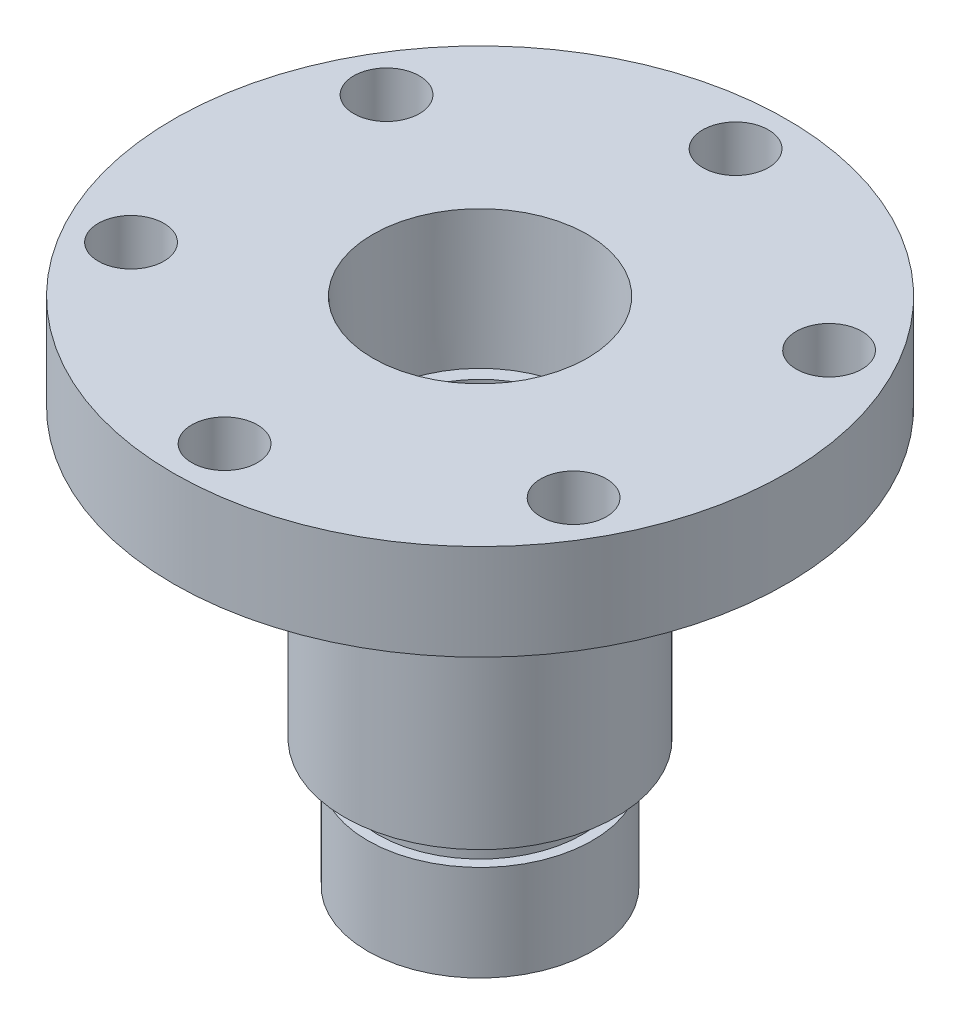
ISO-10303-21;
HEADER;
FILE_DESCRIPTION(('STEP AP214'),'2;1');
FILE_NAME('part.step','',(''),(''),'','','');
FILE_SCHEMA(('AUTOMOTIVE_DESIGN { 1 0 10303 214 1 1 1 1 }'));
ENDSEC;
DATA;
#1=APPLICATION_CONTEXT('core data for automotive mechanical design processes');
#2=APPLICATION_PROTOCOL_DEFINITION('international standard','automotive_design',2000,#1);
#3=PRODUCT_CONTEXT('',#1,'mechanical');
#4=PRODUCT('Part','Part','',(#3));
#5=PRODUCT_RELATED_PRODUCT_CATEGORY('part','',(#4));
#6=PRODUCT_DEFINITION_FORMATION('','',#4);
#7=PRODUCT_DEFINITION_CONTEXT('part definition',#1,'design');
#8=PRODUCT_DEFINITION('design','',#6,#7);
#9=PRODUCT_DEFINITION_SHAPE('','',#8);
#10=(LENGTH_UNIT() NAMED_UNIT(*) SI_UNIT(.MILLI.,.METRE.));
#11=(NAMED_UNIT(*) PLANE_ANGLE_UNIT() SI_UNIT($,.RADIAN.));
#12=(NAMED_UNIT(*) SI_UNIT($,.STERADIAN.) SOLID_ANGLE_UNIT());
#13=UNCERTAINTY_MEASURE_WITH_UNIT(LENGTH_MEASURE(1.E-05),#10,'distance_accuracy_value','');
#14=(GEOMETRIC_REPRESENTATION_CONTEXT(3) GLOBAL_UNCERTAINTY_ASSIGNED_CONTEXT((#13)) GLOBAL_UNIT_ASSIGNED_CONTEXT((#10,
#11,#12)) REPRESENTATION_CONTEXT('',''));
#15=CARTESIAN_POINT('',(0.,0.,0.));
#16=DIRECTION('',(0.,0.,1.));
#17=DIRECTION('',(1.,0.,0.));
#18=AXIS2_PLACEMENT_3D('',#15,#16,#17);
#19=CARTESIAN_POINT('',(0.,0.,0.));
#20=DIRECTION('',(0.,1.,0.));
#21=DIRECTION('',(0.,0.,1.));
#22=AXIS2_PLACEMENT_3D('',#19,#20,#21);
#23=CYLINDRICAL_SURFACE('',#22,7.49999999999999);
#24=CARTESIAN_POINT('',(0.,-23.4640890500333,0.));
#25=DIRECTION('',(0.,1.,0.));
#26=DIRECTION('',(0.,0.,1.));
#27=AXIS2_PLACEMENT_3D('',#24,#25,#26);
#28=CIRCLE('',#27,7.49999999999999);
#29=CARTESIAN_POINT('',(0.,-23.4640890500333,7.49999999999999));
#30=VERTEX_POINT('',#29);
#31=EDGE_CURVE('E69',#30,#30,#28,.F.);
#32=ORIENTED_EDGE('',*,*,#31,.F.);
#33=EDGE_LOOP('',(#32));
#34=FACE_BOUND('',#33,.T.);
#35=CARTESIAN_POINT('',(0.,-50.8,0.));
#36=DIRECTION('',(0.,1.,0.));
#37=DIRECTION('',(0.,0.,1.));
#38=AXIS2_PLACEMENT_3D('',#35,#36,#37);
#39=CIRCLE('',#38,7.49999999999999);
#40=CARTESIAN_POINT('',(0.,-50.8,7.49999999999999));
#41=VERTEX_POINT('',#40);
#42=EDGE_CURVE('E71',#41,#41,#39,.T.);
#43=ORIENTED_EDGE('',*,*,#42,.F.);
#44=EDGE_LOOP('',(#43));
#45=FACE_BOUND('',#44,.T.);
#46=ADVANCED_FACE('F34',(#34,#45),#23,.F.);
#47=CARTESIAN_POINT('',(-7.49999999999999,0.,0.));
#48=DIRECTION('',(0.,1.,0.));
#49=DIRECTION('',(0.,0.,1.));
#50=AXIS2_PLACEMENT_3D('',#47,#48,#49);
#51=PLANE('',#50);
#52=CARTESIAN_POINT('',(0.,0.,-25.4));
#53=DIRECTION('',(0.,1.,0.));
#54=DIRECTION('',(0.,0.,1.));
#55=AXIS2_PLACEMENT_3D('',#52,#53,#54);
#56=CIRCLE('',#55,3.2639);
#57=CARTESIAN_POINT('',(0.,0.,-22.1361));
#58=VERTEX_POINT('',#57);
#59=EDGE_CURVE('E56',#58,#58,#56,.T.);
#60=ORIENTED_EDGE('',*,*,#59,.F.);
#61=EDGE_LOOP('',(#60));
#62=FACE_BOUND('',#61,.T.);
#63=CARTESIAN_POINT('',(-21.9970452561247,0.,-12.7));
#64=DIRECTION('',(0.,1.,0.));
#65=DIRECTION('',(0.,0.,1.));
#66=AXIS2_PLACEMENT_3D('',#63,#64,#65);
#67=CIRCLE('',#66,3.2639);
#68=CARTESIAN_POINT('',(-21.9970452561247,0.,-9.4361));
#69=VERTEX_POINT('',#68);
#70=EDGE_CURVE('E55',#69,#69,#67,.T.);
#71=ORIENTED_EDGE('',*,*,#70,.F.);
#72=EDGE_LOOP('',(#71));
#73=FACE_BOUND('',#72,.T.);
#74=CARTESIAN_POINT('',(-21.9970452561247,0.,12.7));
#75=DIRECTION('',(0.,1.,0.));
#76=DIRECTION('',(0.,0.,1.));
#77=AXIS2_PLACEMENT_3D('',#74,#75,#76);
#78=CIRCLE('',#77,3.2639);
#79=CARTESIAN_POINT('',(-21.9970452561247,0.,15.9639));
#80=VERTEX_POINT('',#79);
#81=EDGE_CURVE('E60',#80,#80,#78,.T.);
#82=ORIENTED_EDGE('',*,*,#81,.F.);
#83=EDGE_LOOP('',(#82));
#84=FACE_BOUND('',#83,.T.);
#85=CARTESIAN_POINT('',(0.,0.,25.4));
#86=DIRECTION('',(0.,1.,0.));
#87=DIRECTION('',(0.,0.,1.));
#88=AXIS2_PLACEMENT_3D('',#85,#86,#87);
#89=CIRCLE('',#88,3.2639);
#90=CARTESIAN_POINT('',(0.,0.,28.6639));
#91=VERTEX_POINT('',#90);
#92=EDGE_CURVE('E64',#91,#91,#89,.T.);
#93=ORIENTED_EDGE('',*,*,#92,.F.);
#94=EDGE_LOOP('',(#93));
#95=FACE_BOUND('',#94,.T.);
#96=CARTESIAN_POINT('',(21.9970452561247,0.,12.7));
#97=DIRECTION('',(0.,1.,0.));
#98=DIRECTION('',(0.,0.,1.));
#99=AXIS2_PLACEMENT_3D('',#96,#97,#98);
#100=CIRCLE('',#99,3.2639);
#101=CARTESIAN_POINT('',(21.9970452561247,0.,15.9639));
#102=VERTEX_POINT('',#101);
#103=EDGE_CURVE('E68',#102,#102,#100,.T.);
#104=ORIENTED_EDGE('',*,*,#103,.F.);
#105=EDGE_LOOP('',(#104));
#106=FACE_BOUND('',#105,.T.);
#107=CARTESIAN_POINT('',(21.9970452561247,0.,-12.7));
#108=DIRECTION('',(0.,1.,0.));
#109=DIRECTION('',(0.,0.,1.));
#110=AXIS2_PLACEMENT_3D('',#107,#108,#109);
#111=CIRCLE('',#110,3.2639);
#112=CARTESIAN_POINT('',(21.9970452561247,0.,-9.43610000000002));
#113=VERTEX_POINT('',#112);
#114=EDGE_CURVE('E125',#113,#113,#111,.T.);
#115=ORIENTED_EDGE('',*,*,#114,.F.);
#116=EDGE_LOOP('',(#115));
#117=FACE_BOUND('',#116,.T.);
#118=CARTESIAN_POINT('',(0.,0.,0.));
#119=DIRECTION('',(0.,1.,0.));
#120=DIRECTION('',(0.,0.,1.));
#121=AXIS2_PLACEMENT_3D('',#118,#119,#120);
#122=CIRCLE('',#121,10.6647361);
#123=CARTESIAN_POINT('',(0.,0.,10.6647361));
#124=VERTEX_POINT('',#123);
#125=EDGE_CURVE('E119',#124,#124,#122,.T.);
#126=ORIENTED_EDGE('',*,*,#125,.F.);
#127=EDGE_LOOP('',(#126));
#128=FACE_BOUND('',#127,.T.);
#129=CARTESIAN_POINT('',(0.,0.,0.));
#130=DIRECTION('',(0.,1.,0.));
#131=DIRECTION('',(0.,0.,1.));
#132=AXIS2_PLACEMENT_3D('',#129,#130,#131);
#133=CIRCLE('',#132,30.48);
#134=CARTESIAN_POINT('',(0.,0.,30.48));
#135=VERTEX_POINT('',#134);
#136=EDGE_CURVE('E45',#135,#135,#133,.T.);
#137=ORIENTED_EDGE('',*,*,#136,.T.);
#138=EDGE_LOOP('',(#137));
#139=FACE_BOUND('',#138,.T.);
#140=ADVANCED_FACE('F144',(#62,#73,#84,#95,#106,#117,#128,#139),#51,.T.);
#141=CARTESIAN_POINT('',(0.,0.,0.));
#142=DIRECTION('',(0.,1.,0.));
#143=DIRECTION('',(0.,0.,1.));
#144=AXIS2_PLACEMENT_3D('',#141,#142,#143);
#145=CYLINDRICAL_SURFACE('',#144,30.48);
#146=CARTESIAN_POINT('',(0.,-9.525,0.));
#147=DIRECTION('',(0.,1.,0.));
#148=DIRECTION('',(0.,0.,1.));
#149=AXIS2_PLACEMENT_3D('',#146,#147,#148);
#150=CIRCLE('',#149,30.48);
#151=CARTESIAN_POINT('',(0.,-9.525,30.48));
#152=VERTEX_POINT('',#151);
#153=EDGE_CURVE('E49',#152,#152,#150,.T.);
#154=ORIENTED_EDGE('',*,*,#153,.T.);
#155=EDGE_LOOP('',(#154));
#156=FACE_BOUND('',#155,.T.);
#157=ORIENTED_EDGE('',*,*,#136,.F.);
#158=EDGE_LOOP('',(#157));
#159=FACE_BOUND('',#158,.T.);
#160=ADVANCED_FACE('F147',(#156,#159),#145,.T.);
#161=CARTESIAN_POINT('',(-30.48,-9.525,0.));
#162=DIRECTION('',(0.,-1.,0.));
#163=DIRECTION('',(0.,0.,-1.));
#164=AXIS2_PLACEMENT_3D('',#161,#162,#163);
#165=PLANE('',#164);
#166=CARTESIAN_POINT('',(0.,-9.525,-25.4));
#167=DIRECTION('',(0.,-1.,0.));
#168=DIRECTION('',(0.,0.,-1.));
#169=AXIS2_PLACEMENT_3D('',#166,#167,#168);
#170=CIRCLE('',#169,3.2639);
#171=CARTESIAN_POINT('',(0.,-9.525,-28.6639));
#172=VERTEX_POINT('',#171);
#173=EDGE_CURVE('E52',#172,#172,#170,.T.);
#174=ORIENTED_EDGE('',*,*,#173,.F.);
#175=EDGE_LOOP('',(#174));
#176=FACE_BOUND('',#175,.T.);
#177=CARTESIAN_POINT('',(-21.9970452561247,-9.525,-12.7));
#178=DIRECTION('',(0.,-1.,0.));
#179=DIRECTION('',(0.,0.,-1.));
#180=AXIS2_PLACEMENT_3D('',#177,#178,#179);
#181=CIRCLE('',#180,3.2639);
#182=CARTESIAN_POINT('',(-21.9970452561247,-9.525,-15.9639));
#183=VERTEX_POINT('',#182);
#184=EDGE_CURVE('E57',#183,#183,#181,.T.);
#185=ORIENTED_EDGE('',*,*,#184,.F.);
#186=EDGE_LOOP('',(#185));
#187=FACE_BOUND('',#186,.T.);
#188=CARTESIAN_POINT('',(-21.9970452561247,-9.525,12.7));
#189=DIRECTION('',(0.,-1.,0.));
#190=DIRECTION('',(0.,0.,-1.));
#191=AXIS2_PLACEMENT_3D('',#188,#189,#190);
#192=CIRCLE('',#191,3.2639);
#193=CARTESIAN_POINT('',(-21.9970452561247,-9.525,9.43610000000001));
#194=VERTEX_POINT('',#193);
#195=EDGE_CURVE('E61',#194,#194,#192,.T.);
#196=ORIENTED_EDGE('',*,*,#195,.F.);
#197=EDGE_LOOP('',(#196));
#198=FACE_BOUND('',#197,.T.);
#199=CARTESIAN_POINT('',(0.,-9.525,25.4));
#200=DIRECTION('',(0.,-1.,0.));
#201=DIRECTION('',(0.,0.,-1.));
#202=AXIS2_PLACEMENT_3D('',#199,#200,#201);
#203=CIRCLE('',#202,3.2639);
#204=CARTESIAN_POINT('',(0.,-9.525,22.1361));
#205=VERTEX_POINT('',#204);
#206=EDGE_CURVE('E65',#205,#205,#203,.T.);
#207=ORIENTED_EDGE('',*,*,#206,.F.);
#208=EDGE_LOOP('',(#207));
#209=FACE_BOUND('',#208,.T.);
#210=CARTESIAN_POINT('',(21.9970452561247,-9.525,12.7));
#211=DIRECTION('',(0.,-1.,0.));
#212=DIRECTION('',(0.,0.,-1.));
#213=AXIS2_PLACEMENT_3D('',#210,#211,#212);
#214=CIRCLE('',#213,3.2639);
#215=CARTESIAN_POINT('',(21.9970452561247,-9.525,9.4361));
#216=VERTEX_POINT('',#215);
#217=EDGE_CURVE('E128',#216,#216,#214,.T.);
#218=ORIENTED_EDGE('',*,*,#217,.F.);
#219=EDGE_LOOP('',(#218));
#220=FACE_BOUND('',#219,.T.);
#221=CARTESIAN_POINT('',(21.9970452561247,-9.525,-12.7));
#222=DIRECTION('',(0.,-1.,0.));
#223=DIRECTION('',(0.,0.,-1.));
#224=AXIS2_PLACEMENT_3D('',#221,#222,#223);
#225=CIRCLE('',#224,3.2639);
#226=CARTESIAN_POINT('',(21.9970452561247,-9.525,-15.9639));
#227=VERTEX_POINT('',#226);
#228=EDGE_CURVE('E122',#227,#227,#225,.T.);
#229=ORIENTED_EDGE('',*,*,#228,.F.);
#230=EDGE_LOOP('',(#229));
#231=FACE_BOUND('',#230,.T.);
#232=CARTESIAN_POINT('',(0.,-9.525,0.));
#233=DIRECTION('',(0.,1.,0.));
#234=DIRECTION('',(0.,0.,1.));
#235=AXIS2_PLACEMENT_3D('',#232,#233,#234);
#236=CIRCLE('',#235,21.);
#237=CARTESIAN_POINT('',(0.,-9.525,21.));
#238=VERTEX_POINT('',#237);
#239=EDGE_CURVE('E76',#238,#238,#236,.T.);
#240=ORIENTED_EDGE('',*,*,#239,.T.);
#241=EDGE_LOOP('',(#240));
#242=FACE_BOUND('',#241,.T.);
#243=ORIENTED_EDGE('',*,*,#153,.F.);
#244=EDGE_LOOP('',(#243));
#245=FACE_BOUND('',#244,.T.);
#246=ADVANCED_FACE('F164',(#176,#187,#198,#209,#220,#231,#242,#245),#165,.T.);
#247=CARTESIAN_POINT('',(0.,0.,0.));
#248=DIRECTION('',(0.,1.,0.));
#249=DIRECTION('',(0.,0.,1.));
#250=AXIS2_PLACEMENT_3D('',#247,#248,#249);
#251=CYLINDRICAL_SURFACE('',#250,21.);
#252=CARTESIAN_POINT('',(0.,-7.775,0.));
#253=DIRECTION('',(0.,1.,0.));
#254=DIRECTION('',(0.,0.,1.));
#255=AXIS2_PLACEMENT_3D('',#252,#253,#254);
#256=CIRCLE('',#255,21.);
#257=CARTESIAN_POINT('',(0.,-7.775,21.));
#258=VERTEX_POINT('',#257);
#259=EDGE_CURVE('E79',#258,#258,#256,.T.);
#260=ORIENTED_EDGE('',*,*,#259,.T.);
#261=EDGE_LOOP('',(#260));
#262=FACE_BOUND('',#261,.T.);
#263=ORIENTED_EDGE('',*,*,#239,.F.);
#264=EDGE_LOOP('',(#263));
#265=FACE_BOUND('',#264,.T.);
#266=ADVANCED_FACE('F170',(#262,#265),#251,.F.);
#267=CARTESIAN_POINT('',(-18.,-7.775,0.));
#268=DIRECTION('',(0.,-1.,0.));
#269=DIRECTION('',(0.,0.,-1.));
#270=AXIS2_PLACEMENT_3D('',#267,#268,#269);
#271=PLANE('',#270);
#272=CARTESIAN_POINT('',(0.,-7.775,0.));
#273=DIRECTION('',(0.,1.,0.));
#274=DIRECTION('',(0.,0.,1.));
#275=AXIS2_PLACEMENT_3D('',#272,#273,#274);
#276=CIRCLE('',#275,18.);
#277=CARTESIAN_POINT('',(0.,-7.775,18.));
#278=VERTEX_POINT('',#277);
#279=EDGE_CURVE('E82',#278,#278,#276,.T.);
#280=ORIENTED_EDGE('',*,*,#279,.T.);
#281=EDGE_LOOP('',(#280));
#282=FACE_BOUND('',#281,.T.);
#283=ORIENTED_EDGE('',*,*,#259,.F.);
#284=EDGE_LOOP('',(#283));
#285=FACE_BOUND('',#284,.T.);
#286=ADVANCED_FACE('F236',(#282,#285),#271,.T.);
#287=CARTESIAN_POINT('',(0.,0.,0.));
#288=DIRECTION('',(0.,1.,0.));
#289=DIRECTION('',(0.,0.,1.));
#290=AXIS2_PLACEMENT_3D('',#287,#288,#289);
#291=CYLINDRICAL_SURFACE('',#290,18.);
#292=CARTESIAN_POINT('',(0.,-9.525,0.));
#293=DIRECTION('',(0.,1.,0.));
#294=DIRECTION('',(0.,0.,1.));
#295=AXIS2_PLACEMENT_3D('',#292,#293,#294);
#296=CIRCLE('',#295,18.);
#297=CARTESIAN_POINT('',(0.,-9.525,18.));
#298=VERTEX_POINT('',#297);
#299=EDGE_CURVE('E85',#298,#298,#296,.T.);
#300=ORIENTED_EDGE('',*,*,#299,.T.);
#301=EDGE_LOOP('',(#300));
#302=FACE_BOUND('',#301,.T.);
#303=ORIENTED_EDGE('',*,*,#279,.F.);
#304=EDGE_LOOP('',(#303));
#305=FACE_BOUND('',#304,.T.);
#306=ADVANCED_FACE('F231',(#302,#305),#291,.T.);
#307=CARTESIAN_POINT('',(-18.,-9.525,0.));
#308=DIRECTION('',(0.,-1.,0.));
#309=DIRECTION('',(0.,0.,-1.));
#310=AXIS2_PLACEMENT_3D('',#307,#308,#309);
#311=PLANE('',#310);
#312=CARTESIAN_POINT('',(0.,-9.525,0.));
#313=DIRECTION('',(0.,-1.,0.));
#314=DIRECTION('',(0.,0.,-1.));
#315=AXIS2_PLACEMENT_3D('',#312,#313,#314);
#316=CIRCLE('',#315,14.5);
#317=CARTESIAN_POINT('',(0.,-9.525,-14.5));
#318=VERTEX_POINT('',#317);
#319=EDGE_CURVE('E41',#318,#318,#316,.F.);
#320=ORIENTED_EDGE('',*,*,#319,.T.);
#321=EDGE_LOOP('',(#320));
#322=FACE_BOUND('',#321,.T.);
#323=ORIENTED_EDGE('',*,*,#299,.F.);
#324=EDGE_LOOP('',(#323));
#325=FACE_BOUND('',#324,.T.);
#326=ADVANCED_FACE('F226',(#322,#325),#311,.T.);
#327=CARTESIAN_POINT('',(0.,0.,0.));
#328=DIRECTION('',(0.,1.,0.));
#329=DIRECTION('',(0.,0.,1.));
#330=AXIS2_PLACEMENT_3D('',#327,#328,#329);
#331=CYLINDRICAL_SURFACE('',#330,13.5);
#332=CARTESIAN_POINT('',(0.,-10.525,0.));
#333=DIRECTION('',(0.,-1.,0.));
#334=DIRECTION('',(0.,0.,-1.));
#335=AXIS2_PLACEMENT_3D('',#332,#333,#334);
#336=CIRCLE('',#335,13.5);
#337=CARTESIAN_POINT('',(0.,-10.525,-13.5));
#338=VERTEX_POINT('',#337);
#339=EDGE_CURVE('E10',#338,#338,#336,.T.);
#340=ORIENTED_EDGE('',*,*,#339,.T.);
#341=EDGE_LOOP('',(#340));
#342=FACE_BOUND('',#341,.T.);
#343=CARTESIAN_POINT('',(0.,-38.1012195861177,0.));
#344=DIRECTION('',(0.,1.,0.));
#345=DIRECTION('',(0.,0.,1.));
#346=AXIS2_PLACEMENT_3D('',#343,#344,#345);
#347=CIRCLE('',#346,13.5);
#348=CARTESIAN_POINT('',(0.,-38.1012195861177,13.5));
#349=VERTEX_POINT('',#348);
#350=EDGE_CURVE('E88',#349,#349,#347,.T.);
#351=ORIENTED_EDGE('',*,*,#350,.T.);
#352=EDGE_LOOP('',(#351));
#353=FACE_BOUND('',#352,.T.);
#354=ADVANCED_FACE('F221',(#342,#353),#331,.T.);
#355=CARTESIAN_POINT('',(-13.5,-38.1012195861177,0.));
#356=DIRECTION('',(0.,-1.,0.));
#357=DIRECTION('',(0.,0.,-1.));
#358=AXIS2_PLACEMENT_3D('',#355,#356,#357);
#359=PLANE('',#358);
#360=CARTESIAN_POINT('',(0.,-38.1012195861177,0.));
#361=DIRECTION('',(0.,1.,0.));
#362=DIRECTION('',(0.,0.,1.));
#363=AXIS2_PLACEMENT_3D('',#360,#361,#362);
#364=CIRCLE('',#363,11.);
#365=CARTESIAN_POINT('',(0.,-38.1012195861177,11.));
#366=VERTEX_POINT('',#365);
#367=EDGE_CURVE('E91',#366,#366,#364,.T.);
#368=ORIENTED_EDGE('',*,*,#367,.T.);
#369=EDGE_LOOP('',(#368));
#370=FACE_BOUND('',#369,.T.);
#371=ORIENTED_EDGE('',*,*,#350,.F.);
#372=EDGE_LOOP('',(#371));
#373=FACE_BOUND('',#372,.T.);
#374=ADVANCED_FACE('F215',(#370,#373),#359,.T.);
#375=CARTESIAN_POINT('',(0.,0.,0.));
#376=DIRECTION('',(0.,1.,0.));
#377=DIRECTION('',(0.,0.,1.));
#378=AXIS2_PLACEMENT_3D('',#375,#376,#377);
#379=CYLINDRICAL_SURFACE('',#378,11.);
#380=CARTESIAN_POINT('',(0.,-39.6887195861177,0.));
#381=DIRECTION('',(0.,1.,0.));
#382=DIRECTION('',(0.,0.,1.));
#383=AXIS2_PLACEMENT_3D('',#380,#381,#382);
#384=CIRCLE('',#383,11.);
#385=CARTESIAN_POINT('',(0.,-39.6887195861177,11.));
#386=VERTEX_POINT('',#385);
#387=EDGE_CURVE('E94',#386,#386,#384,.T.);
#388=ORIENTED_EDGE('',*,*,#387,.T.);
#389=EDGE_LOOP('',(#388));
#390=FACE_BOUND('',#389,.T.);
#391=ORIENTED_EDGE('',*,*,#367,.F.);
#392=EDGE_LOOP('',(#391));
#393=FACE_BOUND('',#392,.T.);
#394=ADVANCED_FACE('F209',(#390,#393),#379,.T.);
#395=CARTESIAN_POINT('',(-10.16,-39.6887195861177,0.));
#396=DIRECTION('',(0.,-1.,0.));
#397=DIRECTION('',(0.,0.,-1.));
#398=AXIS2_PLACEMENT_3D('',#395,#396,#397);
#399=PLANE('',#398);
#400=CARTESIAN_POINT('',(0.,-39.6887195861177,0.));
#401=DIRECTION('',(0.,1.,0.));
#402=DIRECTION('',(0.,0.,1.));
#403=AXIS2_PLACEMENT_3D('',#400,#401,#402);
#404=CIRCLE('',#403,10.16);
#405=CARTESIAN_POINT('',(0.,-39.6887195861177,10.16));
#406=VERTEX_POINT('',#405);
#407=EDGE_CURVE('E97',#406,#406,#404,.T.);
#408=ORIENTED_EDGE('',*,*,#407,.T.);
#409=EDGE_LOOP('',(#408));
#410=FACE_BOUND('',#409,.T.);
#411=ORIENTED_EDGE('',*,*,#387,.F.);
#412=EDGE_LOOP('',(#411));
#413=FACE_BOUND('',#412,.T.);
#414=ADVANCED_FACE('F203',(#410,#413),#399,.T.);
#415=CARTESIAN_POINT('',(0.,0.,0.));
#416=DIRECTION('',(0.,1.,0.));
#417=DIRECTION('',(0.,0.,1.));
#418=AXIS2_PLACEMENT_3D('',#415,#416,#417);
#419=CYLINDRICAL_SURFACE('',#418,10.16);
#420=CARTESIAN_POINT('',(0.,-41.2762195861177,0.));
#421=DIRECTION('',(0.,1.,0.));
#422=DIRECTION('',(0.,0.,1.));
#423=AXIS2_PLACEMENT_3D('',#420,#421,#422);
#424=CIRCLE('',#423,10.16);
#425=CARTESIAN_POINT('',(0.,-41.2762195861177,10.16));
#426=VERTEX_POINT('',#425);
#427=EDGE_CURVE('E100',#426,#426,#424,.T.);
#428=ORIENTED_EDGE('',*,*,#427,.T.);
#429=EDGE_LOOP('',(#428));
#430=FACE_BOUND('',#429,.T.);
#431=ORIENTED_EDGE('',*,*,#407,.F.);
#432=EDGE_LOOP('',(#431));
#433=FACE_BOUND('',#432,.T.);
#434=ADVANCED_FACE('F197',(#430,#433),#419,.T.);
#435=CARTESIAN_POINT('',(-11.176,-41.2762195861177,0.));
#436=DIRECTION('',(0.,1.,0.));
#437=DIRECTION('',(0.,0.,1.));
#438=AXIS2_PLACEMENT_3D('',#435,#436,#437);
#439=PLANE('',#438);
#440=CARTESIAN_POINT('',(0.,-41.2762195861177,0.));
#441=DIRECTION('',(0.,1.,0.));
#442=DIRECTION('',(0.,0.,1.));
#443=AXIS2_PLACEMENT_3D('',#440,#441,#442);
#444=CIRCLE('',#443,11.176);
#445=CARTESIAN_POINT('',(0.,-41.2762195861177,11.176));
#446=VERTEX_POINT('',#445);
#447=EDGE_CURVE('E103',#446,#446,#444,.T.);
#448=ORIENTED_EDGE('',*,*,#447,.T.);
#449=EDGE_LOOP('',(#448));
#450=FACE_BOUND('',#449,.T.);
#451=ORIENTED_EDGE('',*,*,#427,.F.);
#452=EDGE_LOOP('',(#451));
#453=FACE_BOUND('',#452,.T.);
#454=ADVANCED_FACE('F191',(#450,#453),#439,.T.);
#455=CARTESIAN_POINT('',(0.,0.,0.));
#456=DIRECTION('',(0.,1.,0.));
#457=DIRECTION('',(0.,0.,1.));
#458=AXIS2_PLACEMENT_3D('',#455,#456,#457);
#459=CYLINDRICAL_SURFACE('',#458,11.176);
#460=CARTESIAN_POINT('',(0.,-50.8,0.));
#461=DIRECTION('',(0.,1.,0.));
#462=DIRECTION('',(0.,0.,1.));
#463=AXIS2_PLACEMENT_3D('',#460,#461,#462);
#464=CIRCLE('',#463,11.176);
#465=CARTESIAN_POINT('',(0.,-50.8,11.176));
#466=VERTEX_POINT('',#465);
#467=EDGE_CURVE('E106',#466,#466,#464,.T.);
#468=ORIENTED_EDGE('',*,*,#467,.T.);
#469=EDGE_LOOP('',(#468));
#470=FACE_BOUND('',#469,.T.);
#471=ORIENTED_EDGE('',*,*,#447,.F.);
#472=EDGE_LOOP('',(#471));
#473=FACE_BOUND('',#472,.T.);
#474=ADVANCED_FACE('F185',(#470,#473),#459,.T.);
#475=CARTESIAN_POINT('',(-11.176,-50.8,0.));
#476=DIRECTION('',(0.,-1.,0.));
#477=DIRECTION('',(0.,0.,-1.));
#478=AXIS2_PLACEMENT_3D('',#475,#476,#477);
#479=PLANE('',#478);
#480=ORIENTED_EDGE('',*,*,#42,.T.);
#481=EDGE_LOOP('',(#480));
#482=FACE_BOUND('',#481,.T.);
#483=ORIENTED_EDGE('',*,*,#467,.F.);
#484=EDGE_LOOP('',(#483));
#485=FACE_BOUND('',#484,.T.);
#486=ADVANCED_FACE('F181',(#482,#485),#479,.T.);
#487=CARTESIAN_POINT('',(0.,-22.606,0.));
#488=DIRECTION('',(0.,1.,0.));
#489=DIRECTION('',(0.,0.,1.));
#490=AXIS2_PLACEMENT_3D('',#487,#488,#489);
#491=CONICAL_SURFACE('',#490,8.9281,1.02974425867665);
#492=ORIENTED_EDGE('',*,*,#31,.T.);
#493=EDGE_LOOP('',(#492));
#494=FACE_BOUND('',#493,.T.);
#495=CARTESIAN_POINT('',(0.,-22.606,0.));
#496=DIRECTION('',(0.,1.,0.));
#497=DIRECTION('',(0.,0.,1.));
#498=AXIS2_PLACEMENT_3D('',#495,#496,#497);
#499=CIRCLE('',#498,8.9281);
#500=CARTESIAN_POINT('',(0.,-22.606,8.9281));
#501=VERTEX_POINT('',#500);
#502=EDGE_CURVE('E72',#501,#501,#499,.T.);
#503=ORIENTED_EDGE('',*,*,#502,.T.);
#504=EDGE_LOOP('',(#503));
#505=FACE_BOUND('',#504,.T.);
#506=ADVANCED_FACE('F184',(#494,#505),#491,.F.);
#507=CARTESIAN_POINT('',(0.,0.,0.));
#508=DIRECTION('',(0.,1.,0.));
#509=DIRECTION('',(0.,0.,1.));
#510=AXIS2_PLACEMENT_3D('',#507,#508,#509);
#511=CYLINDRICAL_SURFACE('',#510,8.9281);
#512=ORIENTED_EDGE('',*,*,#502,.F.);
#513=EDGE_LOOP('',(#512));
#514=FACE_BOUND('',#513,.T.);
#515=CARTESIAN_POINT('',(0.,-13.462,0.));
#516=DIRECTION('',(0.,1.,0.));
#517=DIRECTION('',(0.,0.,1.));
#518=AXIS2_PLACEMENT_3D('',#515,#516,#517);
#519=CIRCLE('',#518,8.9281);
#520=CARTESIAN_POINT('',(0.,-13.462,8.9281));
#521=VERTEX_POINT('',#520);
#522=EDGE_CURVE('E113',#521,#521,#519,.T.);
#523=ORIENTED_EDGE('',*,*,#522,.T.);
#524=EDGE_LOOP('',(#523));
#525=FACE_BOUND('',#524,.T.);
#526=ADVANCED_FACE('F345',(#514,#525),#511,.F.);
#527=CARTESIAN_POINT('',(8.9281,-13.462,0.));
#528=DIRECTION('',(0.,-1.,0.));
#529=DIRECTION('',(0.,0.,-1.));
#530=AXIS2_PLACEMENT_3D('',#527,#528,#529);
#531=PLANE('',#530);
#532=ORIENTED_EDGE('',*,*,#522,.F.);
#533=EDGE_LOOP('',(#532));
#534=FACE_BOUND('',#533,.T.);
#535=CARTESIAN_POINT('',(0.,-13.462,0.));
#536=DIRECTION('',(0.,1.,0.));
#537=DIRECTION('',(0.,0.,1.));
#538=AXIS2_PLACEMENT_3D('',#535,#536,#537);
#539=CIRCLE('',#538,10.2616657920863);
#540=CARTESIAN_POINT('',(0.,-13.462,10.2616657920863));
#541=VERTEX_POINT('',#540);
#542=EDGE_CURVE('E116',#541,#541,#539,.T.);
#543=ORIENTED_EDGE('',*,*,#542,.T.);
#544=EDGE_LOOP('',(#543));
#545=FACE_BOUND('',#544,.T.);
#546=ADVANCED_FACE('F336',(#534,#545),#531,.F.);
#547=CARTESIAN_POINT('',(0.,0.,0.));
#548=DIRECTION('',(0.,1.,0.));
#549=DIRECTION('',(0.,0.,1.));
#550=AXIS2_PLACEMENT_3D('',#547,#548,#549);
#551=CONICAL_SURFACE('',#550,10.6647361,0.0299323966717029);
#552=ORIENTED_EDGE('',*,*,#542,.F.);
#553=EDGE_LOOP('',(#552));
#554=FACE_BOUND('',#553,.T.);
#555=ORIENTED_EDGE('',*,*,#125,.T.);
#556=EDGE_LOOP('',(#555));
#557=FACE_BOUND('',#556,.T.);
#558=ADVANCED_FACE('F328',(#554,#557),#551,.F.);
#559=CARTESIAN_POINT('',(21.9970452561247,0.,-12.7));
#560=DIRECTION('',(0.,1.,0.));
#561=DIRECTION('',(0.,0.,1.));
#562=AXIS2_PLACEMENT_3D('',#559,#560,#561);
#563=CYLINDRICAL_SURFACE('',#562,3.2639);
#564=ORIENTED_EDGE('',*,*,#228,.T.);
#565=EDGE_LOOP('',(#564));
#566=FACE_BOUND('',#565,.T.);
#567=ORIENTED_EDGE('',*,*,#114,.T.);
#568=EDGE_LOOP('',(#567));
#569=FACE_BOUND('',#568,.T.);
#570=ADVANCED_FACE('F320',(#566,#569),#563,.F.);
#571=CARTESIAN_POINT('',(21.9970452561247,0.,12.7));
#572=DIRECTION('',(0.,1.,0.));
#573=DIRECTION('',(0.,0.,1.));
#574=AXIS2_PLACEMENT_3D('',#571,#572,#573);
#575=CYLINDRICAL_SURFACE('',#574,3.2639);
#576=ORIENTED_EDGE('',*,*,#217,.T.);
#577=EDGE_LOOP('',(#576));
#578=FACE_BOUND('',#577,.T.);
#579=ORIENTED_EDGE('',*,*,#103,.T.);
#580=EDGE_LOOP('',(#579));
#581=FACE_BOUND('',#580,.T.);
#582=ADVANCED_FACE('F312',(#578,#581),#575,.F.);
#583=CARTESIAN_POINT('',(0.,0.,25.4));
#584=DIRECTION('',(0.,1.,0.));
#585=DIRECTION('',(0.,0.,1.));
#586=AXIS2_PLACEMENT_3D('',#583,#584,#585);
#587=CYLINDRICAL_SURFACE('',#586,3.2639);
#588=ORIENTED_EDGE('',*,*,#206,.T.);
#589=EDGE_LOOP('',(#588));
#590=FACE_BOUND('',#589,.T.);
#591=ORIENTED_EDGE('',*,*,#92,.T.);
#592=EDGE_LOOP('',(#591));
#593=FACE_BOUND('',#592,.T.);
#594=ADVANCED_FACE('F304',(#590,#593),#587,.F.);
#595=CARTESIAN_POINT('',(-21.9970452561247,0.,12.7));
#596=DIRECTION('',(0.,1.,0.));
#597=DIRECTION('',(0.,0.,1.));
#598=AXIS2_PLACEMENT_3D('',#595,#596,#597);
#599=CYLINDRICAL_SURFACE('',#598,3.2639);
#600=ORIENTED_EDGE('',*,*,#195,.T.);
#601=EDGE_LOOP('',(#600));
#602=FACE_BOUND('',#601,.T.);
#603=ORIENTED_EDGE('',*,*,#81,.T.);
#604=EDGE_LOOP('',(#603));
#605=FACE_BOUND('',#604,.T.);
#606=ADVANCED_FACE('F296',(#602,#605),#599,.F.);
#607=CARTESIAN_POINT('',(-21.9970452561247,0.,-12.7));
#608=DIRECTION('',(0.,1.,0.));
#609=DIRECTION('',(0.,0.,1.));
#610=AXIS2_PLACEMENT_3D('',#607,#608,#609);
#611=CYLINDRICAL_SURFACE('',#610,3.2639);
#612=ORIENTED_EDGE('',*,*,#184,.T.);
#613=EDGE_LOOP('',(#612));
#614=FACE_BOUND('',#613,.T.);
#615=ORIENTED_EDGE('',*,*,#70,.T.);
#616=EDGE_LOOP('',(#615));
#617=FACE_BOUND('',#616,.T.);
#618=ADVANCED_FACE('F291',(#614,#617),#611,.F.);
#619=CARTESIAN_POINT('',(0.,0.,-25.4));
#620=DIRECTION('',(0.,1.,0.));
#621=DIRECTION('',(0.,0.,1.));
#622=AXIS2_PLACEMENT_3D('',#619,#620,#621);
#623=CYLINDRICAL_SURFACE('',#622,3.2639);
#624=ORIENTED_EDGE('',*,*,#173,.T.);
#625=EDGE_LOOP('',(#624));
#626=FACE_BOUND('',#625,.T.);
#627=ORIENTED_EDGE('',*,*,#59,.T.);
#628=EDGE_LOOP('',(#627));
#629=FACE_BOUND('',#628,.T.);
#630=ADVANCED_FACE('F142',(#626,#629),#623,.F.);
#631=CARTESIAN_POINT('',(0.,-9.525,0.));
#632=DIRECTION('',(0.,1.,0.));
#633=DIRECTION('',(0.,0.,1.));
#634=AXIS2_PLACEMENT_3D('',#631,#632,#633);
#635=CONICAL_SURFACE('',#634,14.5,0.785398163397459);
#636=ORIENTED_EDGE('',*,*,#339,.F.);
#637=EDGE_LOOP('',(#636));
#638=FACE_BOUND('',#637,.T.);
#639=ORIENTED_EDGE('',*,*,#319,.F.);
#640=EDGE_LOOP('',(#639));
#641=FACE_BOUND('',#640,.T.);
#642=ADVANCED_FACE('F36',(#638,#641),#635,.T.);
#643=CLOSED_SHELL('',(#46,#140,#160,#246,#266,#286,#306,#326,#354,#374,#394,#414,#434,#454,#474,
#486,#506,#526,#546,#558,#570,#582,#594,#606,#618,#630,#642));
#644=MANIFOLD_SOLID_BREP('B2',#643);
#645=ADVANCED_BREP_SHAPE_REPRESENTATION('',(#18,#644),#14);
#646=SHAPE_DEFINITION_REPRESENTATION(#9,#645);
ENDSEC;
END-ISO-10303-21;
